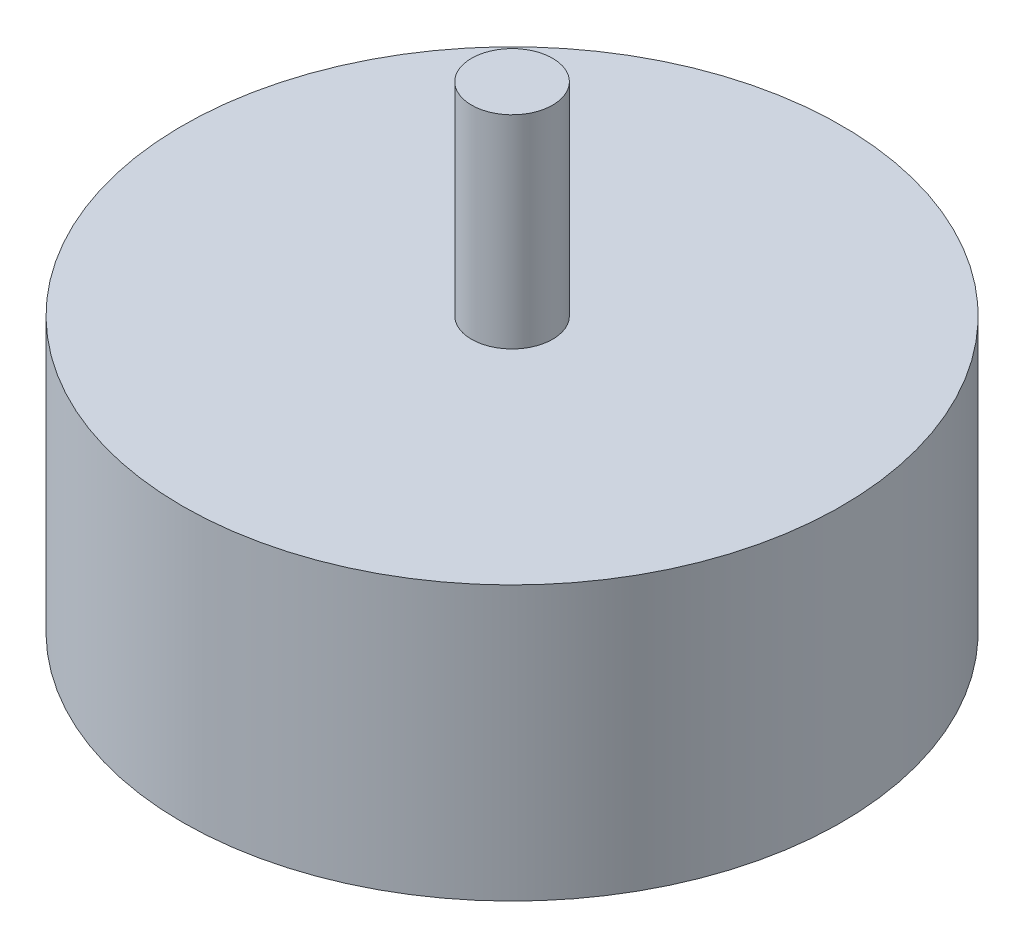
ISO-10303-21;
HEADER;
FILE_DESCRIPTION(('STEP AP214'),'2;1');
FILE_NAME('part.step','',(''),(''),'','','');
FILE_SCHEMA(('AUTOMOTIVE_DESIGN { 1 0 10303 214 1 1 1 1 }'));
ENDSEC;
DATA;
#1=APPLICATION_CONTEXT('core data for automotive mechanical design processes');
#2=APPLICATION_PROTOCOL_DEFINITION('international standard','automotive_design',2000,#1);
#3=PRODUCT_CONTEXT('',#1,'mechanical');
#4=PRODUCT('Part','Part','',(#3));
#5=PRODUCT_RELATED_PRODUCT_CATEGORY('part','',(#4));
#6=PRODUCT_DEFINITION_FORMATION('','',#4);
#7=PRODUCT_DEFINITION_CONTEXT('part definition',#1,'design');
#8=PRODUCT_DEFINITION('design','',#6,#7);
#9=PRODUCT_DEFINITION_SHAPE('','',#8);
#10=(LENGTH_UNIT() NAMED_UNIT(*) SI_UNIT(.MILLI.,.METRE.));
#11=(NAMED_UNIT(*) PLANE_ANGLE_UNIT() SI_UNIT($,.RADIAN.));
#12=(NAMED_UNIT(*) SI_UNIT($,.STERADIAN.) SOLID_ANGLE_UNIT());
#13=UNCERTAINTY_MEASURE_WITH_UNIT(LENGTH_MEASURE(1.E-05),#10,'distance_accuracy_value','');
#14=(GEOMETRIC_REPRESENTATION_CONTEXT(3) GLOBAL_UNCERTAINTY_ASSIGNED_CONTEXT((#13)) GLOBAL_UNIT_ASSIGNED_CONTEXT((#10,
#11,#12)) REPRESENTATION_CONTEXT('',''));
#15=CARTESIAN_POINT('',(0.,0.,0.));
#16=DIRECTION('',(0.,0.,1.));
#17=DIRECTION('',(1.,0.,0.));
#18=AXIS2_PLACEMENT_3D('',#15,#16,#17);
#19=CARTESIAN_POINT('',(0.,27.,0.));
#20=DIRECTION('',(0.,-1.,0.));
#21=DIRECTION('',(0.,0.,-1.));
#22=AXIS2_PLACEMENT_3D('',#19,#20,#21);
#23=CYLINDRICAL_SURFACE('',#22,32.5);
#24=CARTESIAN_POINT('',(0.,27.,0.));
#25=DIRECTION('',(0.,1.,0.));
#26=DIRECTION('',(0.,0.,1.));
#27=AXIS2_PLACEMENT_3D('',#24,#25,#26);
#28=CIRCLE('',#27,32.5);
#29=CARTESIAN_POINT('',(0.,27.,32.5));
#30=VERTEX_POINT('',#29);
#31=EDGE_CURVE('E10',#30,#30,#28,.T.);
#32=ORIENTED_EDGE('',*,*,#31,.F.);
#33=EDGE_LOOP('',(#32));
#34=FACE_BOUND('',#33,.T.);
#35=CARTESIAN_POINT('',(0.,0.,0.));
#36=DIRECTION('',(0.,1.,0.));
#37=DIRECTION('',(0.,0.,1.));
#38=AXIS2_PLACEMENT_3D('',#35,#36,#37);
#39=CIRCLE('',#38,32.5);
#40=CARTESIAN_POINT('',(0.,0.,32.5));
#41=VERTEX_POINT('',#40);
#42=EDGE_CURVE('E39',#41,#41,#39,.T.);
#43=ORIENTED_EDGE('',*,*,#42,.T.);
#44=EDGE_LOOP('',(#43));
#45=FACE_BOUND('',#44,.T.);
#46=ADVANCED_FACE('F36',(#34,#45),#23,.T.);
#47=CARTESIAN_POINT('',(0.,27.,0.));
#48=DIRECTION('',(0.,1.,0.));
#49=DIRECTION('',(0.,0.,1.));
#50=AXIS2_PLACEMENT_3D('',#47,#48,#49);
#51=PLANE('',#50);
#52=CARTESIAN_POINT('',(0.,27.,0.));
#53=DIRECTION('',(0.,1.,0.));
#54=DIRECTION('',(0.,0.,1.));
#55=AXIS2_PLACEMENT_3D('',#52,#53,#54);
#56=CIRCLE('',#55,4.);
#57=CARTESIAN_POINT('',(0.,27.,4.));
#58=VERTEX_POINT('',#57);
#59=EDGE_CURVE('E48',#58,#58,#56,.T.);
#60=ORIENTED_EDGE('',*,*,#59,.F.);
#61=EDGE_LOOP('',(#60));
#62=FACE_BOUND('',#61,.T.);
#63=ORIENTED_EDGE('',*,*,#31,.T.);
#64=EDGE_LOOP('',(#63));
#65=FACE_BOUND('',#64,.T.);
#66=ADVANCED_FACE('F63',(#62,#65),#51,.T.);
#67=CARTESIAN_POINT('',(0.,0.,0.));
#68=DIRECTION('',(0.,1.,0.));
#69=DIRECTION('',(0.,0.,1.));
#70=AXIS2_PLACEMENT_3D('',#67,#68,#69);
#71=PLANE('',#70);
#72=ORIENTED_EDGE('',*,*,#42,.F.);
#73=EDGE_LOOP('',(#72));
#74=FACE_BOUND('',#73,.T.);
#75=ADVANCED_FACE('F59',(#74),#71,.F.);
#76=CARTESIAN_POINT('',(0.,47.,0.));
#77=DIRECTION('',(0.,-1.,0.));
#78=DIRECTION('',(0.,0.,-1.));
#79=AXIS2_PLACEMENT_3D('',#76,#77,#78);
#80=CYLINDRICAL_SURFACE('',#79,4.);
#81=CARTESIAN_POINT('',(0.,47.,0.));
#82=DIRECTION('',(0.,1.,0.));
#83=DIRECTION('',(0.,0.,1.));
#84=AXIS2_PLACEMENT_3D('',#81,#82,#83);
#85=CIRCLE('',#84,4.);
#86=CARTESIAN_POINT('',(0.,47.,4.));
#87=VERTEX_POINT('',#86);
#88=EDGE_CURVE('E46',#87,#87,#85,.T.);
#89=ORIENTED_EDGE('',*,*,#88,.F.);
#90=EDGE_LOOP('',(#89));
#91=FACE_BOUND('',#90,.T.);
#92=ORIENTED_EDGE('',*,*,#59,.T.);
#93=EDGE_LOOP('',(#92));
#94=FACE_BOUND('',#93,.T.);
#95=ADVANCED_FACE('F56',(#91,#94),#80,.T.);
#96=CARTESIAN_POINT('',(0.,47.,0.));
#97=DIRECTION('',(0.,1.,0.));
#98=DIRECTION('',(0.,0.,1.));
#99=AXIS2_PLACEMENT_3D('',#96,#97,#98);
#100=PLANE('',#99);
#101=ORIENTED_EDGE('',*,*,#88,.T.);
#102=EDGE_LOOP('',(#101));
#103=FACE_BOUND('',#102,.T.);
#104=ADVANCED_FACE('F54',(#103),#100,.T.);
#105=CLOSED_SHELL('',(#46,#66,#75,#95,#104));
#106=MANIFOLD_SOLID_BREP('B2',#105);
#107=ADVANCED_BREP_SHAPE_REPRESENTATION('',(#18,#106),#14);
#108=SHAPE_DEFINITION_REPRESENTATION(#9,#107);
ENDSEC;
END-ISO-10303-21;
